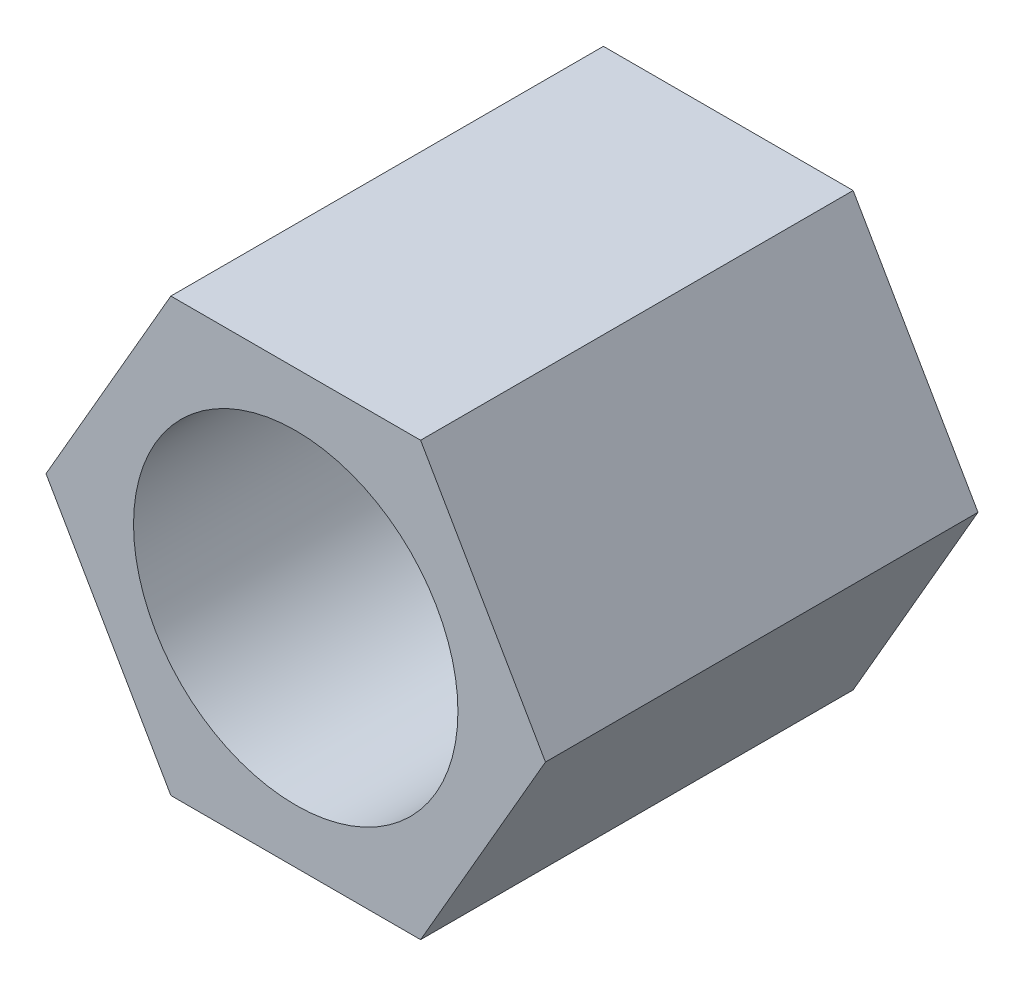
ISO-10303-21;
HEADER;
FILE_DESCRIPTION(('STEP AP214'),'2;1');
FILE_NAME('part.step','',(''),(''),'','','');
FILE_SCHEMA(('AUTOMOTIVE_DESIGN { 1 0 10303 214 1 1 1 1 }'));
ENDSEC;
DATA;
#1=APPLICATION_CONTEXT('core data for automotive mechanical design processes');
#2=APPLICATION_PROTOCOL_DEFINITION('international standard','automotive_design',2000,#1);
#3=PRODUCT_CONTEXT('',#1,'mechanical');
#4=PRODUCT('Part','Part','',(#3));
#5=PRODUCT_RELATED_PRODUCT_CATEGORY('part','',(#4));
#6=PRODUCT_DEFINITION_FORMATION('','',#4);
#7=PRODUCT_DEFINITION_CONTEXT('part definition',#1,'design');
#8=PRODUCT_DEFINITION('design','',#6,#7);
#9=PRODUCT_DEFINITION_SHAPE('','',#8);
#10=(LENGTH_UNIT() NAMED_UNIT(*) SI_UNIT(.MILLI.,.METRE.));
#11=(NAMED_UNIT(*) PLANE_ANGLE_UNIT() SI_UNIT($,.RADIAN.));
#12=(NAMED_UNIT(*) SI_UNIT($,.STERADIAN.) SOLID_ANGLE_UNIT());
#13=UNCERTAINTY_MEASURE_WITH_UNIT(LENGTH_MEASURE(1.E-05),#10,'distance_accuracy_value','');
#14=(GEOMETRIC_REPRESENTATION_CONTEXT(3) GLOBAL_UNCERTAINTY_ASSIGNED_CONTEXT((#13)) GLOBAL_UNIT_ASSIGNED_CONTEXT((#10,
#11,#12)) REPRESENTATION_CONTEXT('',''));
#15=CARTESIAN_POINT('',(0.,0.,0.));
#16=DIRECTION('',(0.,0.,1.));
#17=DIRECTION('',(1.,0.,0.));
#18=AXIS2_PLACEMENT_3D('',#15,#16,#17);
#19=CARTESIAN_POINT('',(0.,0.,4.));
#20=DIRECTION('',(0.,0.,1.));
#21=DIRECTION('',(1.,0.,0.));
#22=AXIS2_PLACEMENT_3D('',#19,#20,#21);
#23=PLANE('',#22);
#24=DIRECTION('',(0.5,0.866025403784439,0.));
#25=VECTOR('',#24,1.);
#26=CARTESIAN_POINT('',(1.15470053837925,-2.,4.));
#27=LINE('',#26,#25);
#28=CARTESIAN_POINT('',(1.15470053837925,-2.,4.));
#29=VERTEX_POINT('',#28);
#30=CARTESIAN_POINT('',(2.3094010767585,0.,4.));
#31=VERTEX_POINT('',#30);
#32=EDGE_CURVE('E150',#29,#31,#27,.T.);
#33=ORIENTED_EDGE('',*,*,#32,.T.);
#34=DIRECTION('',(-0.5,0.866025403784439,0.));
#35=VECTOR('',#34,1.);
#36=CARTESIAN_POINT('',(2.3094010767585,0.,4.));
#37=LINE('',#36,#35);
#38=CARTESIAN_POINT('',(1.15470053837925,2.,4.));
#39=VERTEX_POINT('',#38);
#40=EDGE_CURVE('E98',#31,#39,#37,.T.);
#41=ORIENTED_EDGE('',*,*,#40,.T.);
#42=DIRECTION('',(-1.,0.,0.));
#43=VECTOR('',#42,1.);
#44=CARTESIAN_POINT('',(1.15470053837925,2.,4.));
#45=LINE('',#44,#43);
#46=CARTESIAN_POINT('',(-1.15470053837925,2.,4.));
#47=VERTEX_POINT('',#46);
#48=EDGE_CURVE('E111',#39,#47,#45,.T.);
#49=ORIENTED_EDGE('',*,*,#48,.T.);
#50=DIRECTION('',(-0.5,-0.866025403784439,0.));
#51=VECTOR('',#50,1.);
#52=CARTESIAN_POINT('',(-1.15470053837925,2.,4.));
#53=LINE('',#52,#51);
#54=CARTESIAN_POINT('',(-2.3094010767585,0.,4.));
#55=VERTEX_POINT('',#54);
#56=EDGE_CURVE('E105',#47,#55,#53,.T.);
#57=ORIENTED_EDGE('',*,*,#56,.T.);
#58=DIRECTION('',(0.5,-0.866025403784438,0.));
#59=VECTOR('',#58,1.);
#60=CARTESIAN_POINT('',(-2.3094010767585,0.,4.));
#61=LINE('',#60,#59);
#62=CARTESIAN_POINT('',(-1.15470053837925,-2.,4.));
#63=VERTEX_POINT('',#62);
#64=EDGE_CURVE('E109',#55,#63,#61,.T.);
#65=ORIENTED_EDGE('',*,*,#64,.T.);
#66=DIRECTION('',(1.,0.,0.));
#67=VECTOR('',#66,1.);
#68=CARTESIAN_POINT('',(-1.15470053837925,-2.,4.));
#69=LINE('',#68,#67);
#70=EDGE_CURVE('E61',#63,#29,#69,.T.);
#71=ORIENTED_EDGE('',*,*,#70,.T.);
#72=EDGE_LOOP('',(#33,#41,#49,#57,#65,#71));
#73=FACE_BOUND('',#72,.T.);
#74=CARTESIAN_POINT('',(0.,0.,4.));
#75=DIRECTION('',(0.,0.,1.));
#76=DIRECTION('',(1.,0.,0.));
#77=AXIS2_PLACEMENT_3D('',#74,#75,#76);
#78=CIRCLE('',#77,1.5);
#79=CARTESIAN_POINT('',(1.5,0.,4.));
#80=VERTEX_POINT('',#79);
#81=EDGE_CURVE('E138',#80,#80,#78,.T.);
#82=ORIENTED_EDGE('',*,*,#81,.F.);
#83=EDGE_LOOP('',(#82));
#84=FACE_BOUND('',#83,.T.);
#85=ADVANCED_FACE('F43',(#73,#84),#23,.T.);
#86=CARTESIAN_POINT('',(0.,0.,0.));
#87=DIRECTION('',(0.,0.,1.));
#88=DIRECTION('',(1.,0.,0.));
#89=AXIS2_PLACEMENT_3D('',#86,#87,#88);
#90=PLANE('',#89);
#91=DIRECTION('',(0.5,0.866025403784439,0.));
#92=VECTOR('',#91,1.);
#93=CARTESIAN_POINT('',(1.15470053837925,-2.,0.));
#94=LINE('',#93,#92);
#95=CARTESIAN_POINT('',(1.15470053837925,-2.,0.));
#96=VERTEX_POINT('',#95);
#97=CARTESIAN_POINT('',(2.3094010767585,0.,0.));
#98=VERTEX_POINT('',#97);
#99=EDGE_CURVE('E133',#96,#98,#94,.T.);
#100=ORIENTED_EDGE('',*,*,#99,.F.);
#101=DIRECTION('',(1.,0.,0.));
#102=VECTOR('',#101,1.);
#103=CARTESIAN_POINT('',(-1.15470053837925,-2.,0.));
#104=LINE('',#103,#102);
#105=CARTESIAN_POINT('',(-1.15470053837925,-2.,0.));
#106=VERTEX_POINT('',#105);
#107=EDGE_CURVE('E90',#106,#96,#104,.T.);
#108=ORIENTED_EDGE('',*,*,#107,.F.);
#109=DIRECTION('',(0.5,-0.866025403784438,0.));
#110=VECTOR('',#109,1.);
#111=CARTESIAN_POINT('',(-2.3094010767585,0.,0.));
#112=LINE('',#111,#110);
#113=CARTESIAN_POINT('',(-2.3094010767585,0.,0.));
#114=VERTEX_POINT('',#113);
#115=EDGE_CURVE('E84',#114,#106,#112,.T.);
#116=ORIENTED_EDGE('',*,*,#115,.F.);
#117=DIRECTION('',(-0.5,-0.866025403784439,0.));
#118=VECTOR('',#117,1.);
#119=CARTESIAN_POINT('',(-1.15470053837925,2.,0.));
#120=LINE('',#119,#118);
#121=CARTESIAN_POINT('',(-1.15470053837925,2.,0.));
#122=VERTEX_POINT('',#121);
#123=EDGE_CURVE('E120',#122,#114,#120,.T.);
#124=ORIENTED_EDGE('',*,*,#123,.F.);
#125=DIRECTION('',(-1.,0.,0.));
#126=VECTOR('',#125,1.);
#127=CARTESIAN_POINT('',(1.15470053837925,2.,0.));
#128=LINE('',#127,#126);
#129=CARTESIAN_POINT('',(1.15470053837925,2.,0.));
#130=VERTEX_POINT('',#129);
#131=EDGE_CURVE('E141',#130,#122,#128,.T.);
#132=ORIENTED_EDGE('',*,*,#131,.F.);
#133=DIRECTION('',(-0.5,0.866025403784439,0.));
#134=VECTOR('',#133,1.);
#135=CARTESIAN_POINT('',(2.3094010767585,0.,0.));
#136=LINE('',#135,#134);
#137=EDGE_CURVE('E137',#98,#130,#136,.T.);
#138=ORIENTED_EDGE('',*,*,#137,.F.);
#139=EDGE_LOOP('',(#100,#108,#116,#124,#132,#138));
#140=FACE_BOUND('',#139,.T.);
#141=CARTESIAN_POINT('',(0.,0.,0.));
#142=DIRECTION('',(0.,0.,1.));
#143=DIRECTION('',(1.,0.,0.));
#144=AXIS2_PLACEMENT_3D('',#141,#142,#143);
#145=CIRCLE('',#144,1.5);
#146=CARTESIAN_POINT('',(1.5,0.,0.));
#147=VERTEX_POINT('',#146);
#148=EDGE_CURVE('E265',#147,#147,#145,.T.);
#149=ORIENTED_EDGE('',*,*,#148,.T.);
#150=EDGE_LOOP('',(#149));
#151=FACE_BOUND('',#150,.T.);
#152=ADVANCED_FACE('F163',(#140,#151),#90,.F.);
#153=CARTESIAN_POINT('',(1.15470053837925,-2.,4.));
#154=DIRECTION('',(-0.866025403784439,0.5,0.));
#155=DIRECTION('',(-0.5,-0.866025403784439,0.));
#156=AXIS2_PLACEMENT_3D('',#153,#154,#155);
#157=PLANE('',#156);
#158=ORIENTED_EDGE('',*,*,#99,.T.);
#159=DIRECTION('',(0.,0.,-1.));
#160=VECTOR('',#159,1.);
#161=CARTESIAN_POINT('',(2.3094010767585,0.,4.));
#162=LINE('',#161,#160);
#163=EDGE_CURVE('E11',#31,#98,#162,.T.);
#164=ORIENTED_EDGE('',*,*,#163,.F.);
#165=ORIENTED_EDGE('',*,*,#32,.F.);
#166=DIRECTION('',(0.,0.,-1.));
#167=VECTOR('',#166,1.);
#168=CARTESIAN_POINT('',(1.15470053837925,-2.,4.));
#169=LINE('',#168,#167);
#170=EDGE_CURVE('E129',#29,#96,#169,.T.);
#171=ORIENTED_EDGE('',*,*,#170,.T.);
#172=EDGE_LOOP('',(#158,#164,#165,#171));
#173=FACE_BOUND('',#172,.T.);
#174=ADVANCED_FACE('F45',(#173),#157,.F.);
#175=CARTESIAN_POINT('',(2.3094010767585,0.,4.));
#176=DIRECTION('',(-0.866025403784439,-0.5,0.));
#177=DIRECTION('',(0.5,-0.866025403784439,0.));
#178=AXIS2_PLACEMENT_3D('',#175,#176,#177);
#179=PLANE('',#178);
#180=ORIENTED_EDGE('',*,*,#137,.T.);
#181=DIRECTION('',(0.,0.,-1.));
#182=VECTOR('',#181,1.);
#183=CARTESIAN_POINT('',(1.15470053837925,2.,4.));
#184=LINE('',#183,#182);
#185=EDGE_CURVE('E53',#39,#130,#184,.T.);
#186=ORIENTED_EDGE('',*,*,#185,.F.);
#187=ORIENTED_EDGE('',*,*,#40,.F.);
#188=ORIENTED_EDGE('',*,*,#163,.T.);
#189=EDGE_LOOP('',(#180,#186,#187,#188));
#190=FACE_BOUND('',#189,.T.);
#191=ADVANCED_FACE('F188',(#190),#179,.F.);
#192=CARTESIAN_POINT('',(1.15470053837925,2.,4.));
#193=DIRECTION('',(0.,-1.,0.));
#194=DIRECTION('',(0.,0.,-1.));
#195=AXIS2_PLACEMENT_3D('',#192,#193,#194);
#196=PLANE('',#195);
#197=ORIENTED_EDGE('',*,*,#131,.T.);
#198=DIRECTION('',(0.,0.,-1.));
#199=VECTOR('',#198,1.);
#200=CARTESIAN_POINT('',(-1.15470053837925,2.,4.));
#201=LINE('',#200,#199);
#202=EDGE_CURVE('E122',#47,#122,#201,.T.);
#203=ORIENTED_EDGE('',*,*,#202,.F.);
#204=ORIENTED_EDGE('',*,*,#48,.F.);
#205=ORIENTED_EDGE('',*,*,#185,.T.);
#206=EDGE_LOOP('',(#197,#203,#204,#205));
#207=FACE_BOUND('',#206,.T.);
#208=ADVANCED_FACE('F160',(#207),#196,.F.);
#209=CARTESIAN_POINT('',(-1.15470053837925,2.,4.));
#210=DIRECTION('',(0.866025403784439,-0.5,0.));
#211=DIRECTION('',(0.5,0.866025403784439,0.));
#212=AXIS2_PLACEMENT_3D('',#209,#210,#211);
#213=PLANE('',#212);
#214=ORIENTED_EDGE('',*,*,#123,.T.);
#215=DIRECTION('',(0.,0.,-1.));
#216=VECTOR('',#215,1.);
#217=CARTESIAN_POINT('',(-2.3094010767585,0.,4.));
#218=LINE('',#217,#216);
#219=EDGE_CURVE('E117',#55,#114,#218,.T.);
#220=ORIENTED_EDGE('',*,*,#219,.F.);
#221=ORIENTED_EDGE('',*,*,#56,.F.);
#222=ORIENTED_EDGE('',*,*,#202,.T.);
#223=EDGE_LOOP('',(#214,#220,#221,#222));
#224=FACE_BOUND('',#223,.T.);
#225=ADVANCED_FACE('F118',(#224),#213,.F.);
#226=CARTESIAN_POINT('',(-2.3094010767585,0.,4.));
#227=DIRECTION('',(0.866025403784438,0.5,0.));
#228=DIRECTION('',(-0.5,0.866025403784438,0.));
#229=AXIS2_PLACEMENT_3D('',#226,#227,#228);
#230=PLANE('',#229);
#231=ORIENTED_EDGE('',*,*,#115,.T.);
#232=DIRECTION('',(0.,0.,-1.));
#233=VECTOR('',#232,1.);
#234=CARTESIAN_POINT('',(-1.15470053837925,-2.,4.));
#235=LINE('',#234,#233);
#236=EDGE_CURVE('E123',#63,#106,#235,.T.);
#237=ORIENTED_EDGE('',*,*,#236,.F.);
#238=ORIENTED_EDGE('',*,*,#64,.F.);
#239=ORIENTED_EDGE('',*,*,#219,.T.);
#240=EDGE_LOOP('',(#231,#237,#238,#239));
#241=FACE_BOUND('',#240,.T.);
#242=ADVANCED_FACE('F125',(#241),#230,.F.);
#243=CARTESIAN_POINT('',(-1.15470053837925,-2.,4.));
#244=DIRECTION('',(0.,1.,0.));
#245=DIRECTION('',(0.,0.,1.));
#246=AXIS2_PLACEMENT_3D('',#243,#244,#245);
#247=PLANE('',#246);
#248=ORIENTED_EDGE('',*,*,#107,.T.);
#249=ORIENTED_EDGE('',*,*,#170,.F.);
#250=ORIENTED_EDGE('',*,*,#70,.F.);
#251=ORIENTED_EDGE('',*,*,#236,.T.);
#252=EDGE_LOOP('',(#248,#249,#250,#251));
#253=FACE_BOUND('',#252,.T.);
#254=ADVANCED_FACE('F168',(#253),#247,.F.);
#255=CARTESIAN_POINT('',(0.,0.,4.));
#256=DIRECTION('',(0.,0.,-1.));
#257=DIRECTION('',(-1.,0.,0.));
#258=AXIS2_PLACEMENT_3D('',#255,#256,#257);
#259=CYLINDRICAL_SURFACE('',#258,1.5);
#260=ORIENTED_EDGE('',*,*,#81,.T.);
#261=EDGE_LOOP('',(#260));
#262=FACE_BOUND('',#261,.T.);
#263=ORIENTED_EDGE('',*,*,#148,.F.);
#264=EDGE_LOOP('',(#263));
#265=FACE_BOUND('',#264,.T.);
#266=ADVANCED_FACE('F170',(#262,#265),#259,.F.);
#267=CLOSED_SHELL('',(#85,#152,#174,#191,#208,#225,#242,#254,#266));
#268=MANIFOLD_SOLID_BREP('B2',#267);
#269=ADVANCED_BREP_SHAPE_REPRESENTATION('',(#18,#268),#14);
#270=SHAPE_DEFINITION_REPRESENTATION(#9,#269);
ENDSEC;
END-ISO-10303-21;
